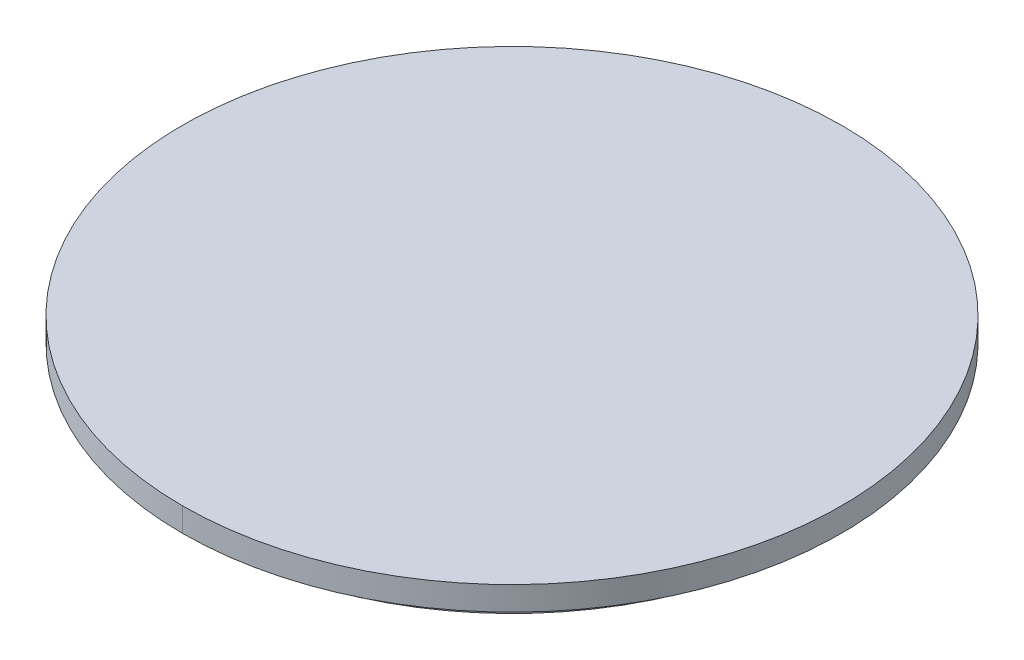
ISO-10303-21;
HEADER;
FILE_DESCRIPTION(('STEP AP214'),'2;1');
FILE_NAME('part.step','',(''),(''),'','','');
FILE_SCHEMA(('AUTOMOTIVE_DESIGN { 1 0 10303 214 1 1 1 1 }'));
ENDSEC;
DATA;
#1=APPLICATION_CONTEXT('core data for automotive mechanical design processes');
#2=APPLICATION_PROTOCOL_DEFINITION('international standard','automotive_design',2000,#1);
#3=PRODUCT_CONTEXT('',#1,'mechanical');
#4=PRODUCT('Part','Part','',(#3));
#5=PRODUCT_RELATED_PRODUCT_CATEGORY('part','',(#4));
#6=PRODUCT_DEFINITION_FORMATION('','',#4);
#7=PRODUCT_DEFINITION_CONTEXT('part definition',#1,'design');
#8=PRODUCT_DEFINITION('design','',#6,#7);
#9=PRODUCT_DEFINITION_SHAPE('','',#8);
#10=(LENGTH_UNIT() NAMED_UNIT(*) SI_UNIT(.MILLI.,.METRE.));
#11=(NAMED_UNIT(*) PLANE_ANGLE_UNIT() SI_UNIT($,.RADIAN.));
#12=(NAMED_UNIT(*) SI_UNIT($,.STERADIAN.) SOLID_ANGLE_UNIT());
#13=UNCERTAINTY_MEASURE_WITH_UNIT(LENGTH_MEASURE(1.E-05),#10,'distance_accuracy_value','');
#14=(GEOMETRIC_REPRESENTATION_CONTEXT(3) GLOBAL_UNCERTAINTY_ASSIGNED_CONTEXT((#13)) GLOBAL_UNIT_ASSIGNED_CONTEXT((#10,
#11,#12)) REPRESENTATION_CONTEXT('',''));
#15=CARTESIAN_POINT('',(0.,0.,0.));
#16=DIRECTION('',(0.,0.,1.));
#17=DIRECTION('',(1.,0.,0.));
#18=AXIS2_PLACEMENT_3D('',#15,#16,#17);
#19=CARTESIAN_POINT('',(0.,-4.5,0.));
#20=DIRECTION('',(0.,1.,0.));
#21=DIRECTION('',(0.,0.,-1.));
#22=AXIS2_PLACEMENT_3D('',#19,#20,#21);
#23=PLANE('',#22);
#24=CARTESIAN_POINT('',(0.,-4.5,0.));
#25=DIRECTION('',(0.,1.,0.));
#26=DIRECTION('',(0.,0.,-1.));
#27=AXIS2_PLACEMENT_3D('',#24,#25,#26);
#28=CIRCLE('',#27,31.85);
#29=CARTESIAN_POINT('',(0.,-4.5,-31.85));
#30=VERTEX_POINT('',#29);
#31=CARTESIAN_POINT('',(0.,-4.5,31.85));
#32=VERTEX_POINT('',#31);
#33=EDGE_CURVE('E26',#30,#32,#28,.T.);
#34=ORIENTED_EDGE('',*,*,#33,.F.);
#35=CARTESIAN_POINT('',(0.,-4.5,0.));
#36=DIRECTION('',(0.,-1.,0.));
#37=DIRECTION('',(0.,0.,-1.));
#38=AXIS2_PLACEMENT_3D('',#35,#36,#37);
#39=CIRCLE('',#38,31.85);
#40=EDGE_CURVE('E9',#30,#32,#39,.T.);
#41=ORIENTED_EDGE('',*,*,#40,.T.);
#42=EDGE_LOOP('',(#34,#41));
#43=FACE_BOUND('',#42,.T.);
#44=ADVANCED_FACE('F15',(#43),#23,.F.);
#45=CARTESIAN_POINT('',(0.,-4.725,0.));
#46=DIRECTION('',(0.,-1.,0.));
#47=DIRECTION('',(0.,0.,-1.));
#48=AXIS2_PLACEMENT_3D('',#45,#46,#47);
#49=CYLINDRICAL_SURFACE('',#48,31.85);
#50=ORIENTED_EDGE('',*,*,#33,.T.);
#51=DIRECTION('',(0.,1.,0.));
#52=VECTOR('',#51,1.);
#53=CARTESIAN_POINT('',(0.,-4.5,31.85));
#54=LINE('',#53,#52);
#55=CARTESIAN_POINT('',(0.,-2.5,31.85));
#56=VERTEX_POINT('',#55);
#57=EDGE_CURVE('E19',#32,#56,#54,.T.);
#58=ORIENTED_EDGE('',*,*,#57,.T.);
#59=CARTESIAN_POINT('',(0.,-2.5,0.));
#60=DIRECTION('',(0.,1.,0.));
#61=DIRECTION('',(0.,0.,-1.));
#62=AXIS2_PLACEMENT_3D('',#59,#60,#61);
#63=CIRCLE('',#62,31.85);
#64=CARTESIAN_POINT('',(0.,-2.5,-31.85));
#65=VERTEX_POINT('',#64);
#66=EDGE_CURVE('E80',#65,#56,#63,.T.);
#67=ORIENTED_EDGE('',*,*,#66,.F.);
#68=DIRECTION('',(0.,1.,0.));
#69=VECTOR('',#68,1.);
#70=CARTESIAN_POINT('',(0.,-4.5,-31.85));
#71=LINE('',#70,#69);
#72=EDGE_CURVE('E83',#30,#65,#71,.T.);
#73=ORIENTED_EDGE('',*,*,#72,.F.);
#74=EDGE_LOOP('',(#50,#58,#67,#73));
#75=FACE_BOUND('',#74,.T.);
#76=ADVANCED_FACE('F17',(#75),#49,.T.);
#77=CARTESIAN_POINT('',(0.,-4.725,0.));
#78=DIRECTION('',(0.,-1.,0.));
#79=DIRECTION('',(0.,0.,-1.));
#80=AXIS2_PLACEMENT_3D('',#77,#78,#79);
#81=CYLINDRICAL_SURFACE('',#80,31.85);
#82=CARTESIAN_POINT('',(0.,-2.5,0.));
#83=DIRECTION('',(0.,-1.,0.));
#84=DIRECTION('',(0.,0.,-1.));
#85=AXIS2_PLACEMENT_3D('',#82,#83,#84);
#86=CIRCLE('',#85,31.85);
#87=EDGE_CURVE('E93',#65,#56,#86,.T.);
#88=ORIENTED_EDGE('',*,*,#87,.T.);
#89=ORIENTED_EDGE('',*,*,#57,.F.);
#90=ORIENTED_EDGE('',*,*,#40,.F.);
#91=ORIENTED_EDGE('',*,*,#72,.T.);
#92=EDGE_LOOP('',(#88,#89,#90,#91));
#93=FACE_BOUND('',#92,.T.);
#94=ADVANCED_FACE('F153',(#93),#81,.T.);
#95=CARTESIAN_POINT('',(0.,-2.5,0.));
#96=DIRECTION('',(0.,1.,0.));
#97=DIRECTION('',(0.,0.,-1.));
#98=AXIS2_PLACEMENT_3D('',#95,#96,#97);
#99=PLANE('',#98);
#100=ORIENTED_EDGE('',*,*,#66,.T.);
#101=ORIENTED_EDGE('',*,*,#87,.F.);
#102=EDGE_LOOP('',(#100,#101));
#103=FACE_BOUND('',#102,.T.);
#104=CARTESIAN_POINT('',(0.,-2.5,0.));
#105=DIRECTION('',(0.,-1.,0.));
#106=DIRECTION('',(0.,0.,-1.));
#107=AXIS2_PLACEMENT_3D('',#104,#105,#106);
#108=CIRCLE('',#107,34.5);
#109=CARTESIAN_POINT('',(0.,-2.5,-34.5));
#110=VERTEX_POINT('',#109);
#111=CARTESIAN_POINT('',(0.,-2.5,34.5));
#112=VERTEX_POINT('',#111);
#113=EDGE_CURVE('E70',#110,#112,#108,.T.);
#114=ORIENTED_EDGE('',*,*,#113,.T.);
#115=CARTESIAN_POINT('',(0.,-2.5,0.));
#116=DIRECTION('',(0.,1.,0.));
#117=DIRECTION('',(0.,0.,-1.));
#118=AXIS2_PLACEMENT_3D('',#115,#116,#117);
#119=CIRCLE('',#118,34.5);
#120=EDGE_CURVE('E58',#110,#112,#119,.T.);
#121=ORIENTED_EDGE('',*,*,#120,.F.);
#122=EDGE_LOOP('',(#114,#121));
#123=FACE_BOUND('',#122,.T.);
#124=ADVANCED_FACE('F148',(#103,#123),#99,.F.);
#125=CARTESIAN_POINT('',(0.,-4.725,0.));
#126=DIRECTION('',(0.,-1.,0.));
#127=DIRECTION('',(0.,0.,-1.));
#128=AXIS2_PLACEMENT_3D('',#125,#126,#127);
#129=CYLINDRICAL_SURFACE('',#128,34.5);
#130=CARTESIAN_POINT('',(0.,0.,0.));
#131=DIRECTION('',(0.,-1.,0.));
#132=DIRECTION('',(0.,0.,-1.));
#133=AXIS2_PLACEMENT_3D('',#130,#131,#132);
#134=CIRCLE('',#133,34.5);
#135=CARTESIAN_POINT('',(0.,0.,-34.5));
#136=VERTEX_POINT('',#135);
#137=CARTESIAN_POINT('',(0.,0.,34.5));
#138=VERTEX_POINT('',#137);
#139=EDGE_CURVE('E65',#136,#138,#134,.T.);
#140=ORIENTED_EDGE('',*,*,#139,.T.);
#141=DIRECTION('',(0.,1.,0.));
#142=VECTOR('',#141,1.);
#143=CARTESIAN_POINT('',(0.,-2.5,34.5));
#144=LINE('',#143,#142);
#145=EDGE_CURVE('E52',#112,#138,#144,.T.);
#146=ORIENTED_EDGE('',*,*,#145,.F.);
#147=ORIENTED_EDGE('',*,*,#113,.F.);
#148=DIRECTION('',(0.,1.,0.));
#149=VECTOR('',#148,1.);
#150=CARTESIAN_POINT('',(0.,-2.5,-34.5));
#151=LINE('',#150,#149);
#152=EDGE_CURVE('E67',#110,#136,#151,.T.);
#153=ORIENTED_EDGE('',*,*,#152,.T.);
#154=EDGE_LOOP('',(#140,#146,#147,#153));
#155=FACE_BOUND('',#154,.T.);
#156=ADVANCED_FACE('F66',(#155),#129,.T.);
#157=CARTESIAN_POINT('',(0.,-4.725,0.));
#158=DIRECTION('',(0.,-1.,0.));
#159=DIRECTION('',(0.,0.,-1.));
#160=AXIS2_PLACEMENT_3D('',#157,#158,#159);
#161=CYLINDRICAL_SURFACE('',#160,34.5);
#162=ORIENTED_EDGE('',*,*,#120,.T.);
#163=ORIENTED_EDGE('',*,*,#145,.T.);
#164=CARTESIAN_POINT('',(0.,0.,0.));
#165=DIRECTION('',(0.,1.,0.));
#166=DIRECTION('',(0.,0.,-1.));
#167=AXIS2_PLACEMENT_3D('',#164,#165,#166);
#168=CIRCLE('',#167,34.5);
#169=EDGE_CURVE('E57',#136,#138,#168,.T.);
#170=ORIENTED_EDGE('',*,*,#169,.F.);
#171=ORIENTED_EDGE('',*,*,#152,.F.);
#172=EDGE_LOOP('',(#162,#163,#170,#171));
#173=FACE_BOUND('',#172,.T.);
#174=ADVANCED_FACE('F54',(#173),#161,.T.);
#175=CARTESIAN_POINT('',(0.,0.,0.));
#176=DIRECTION('',(0.,1.,0.));
#177=DIRECTION('',(0.,0.,-1.));
#178=AXIS2_PLACEMENT_3D('',#175,#176,#177);
#179=PLANE('',#178);
#180=ORIENTED_EDGE('',*,*,#169,.T.);
#181=ORIENTED_EDGE('',*,*,#139,.F.);
#182=EDGE_LOOP('',(#180,#181));
#183=FACE_BOUND('',#182,.T.);
#184=ADVANCED_FACE('F72',(#183),#179,.T.);
#185=CLOSED_SHELL('',(#44,#76,#94,#124,#156,#174,#184));
#186=MANIFOLD_SOLID_BREP('B1',#185);
#187=ADVANCED_BREP_SHAPE_REPRESENTATION('',(#18,#186),#14);
#188=SHAPE_DEFINITION_REPRESENTATION(#9,#187);
ENDSEC;
END-ISO-10303-21;
